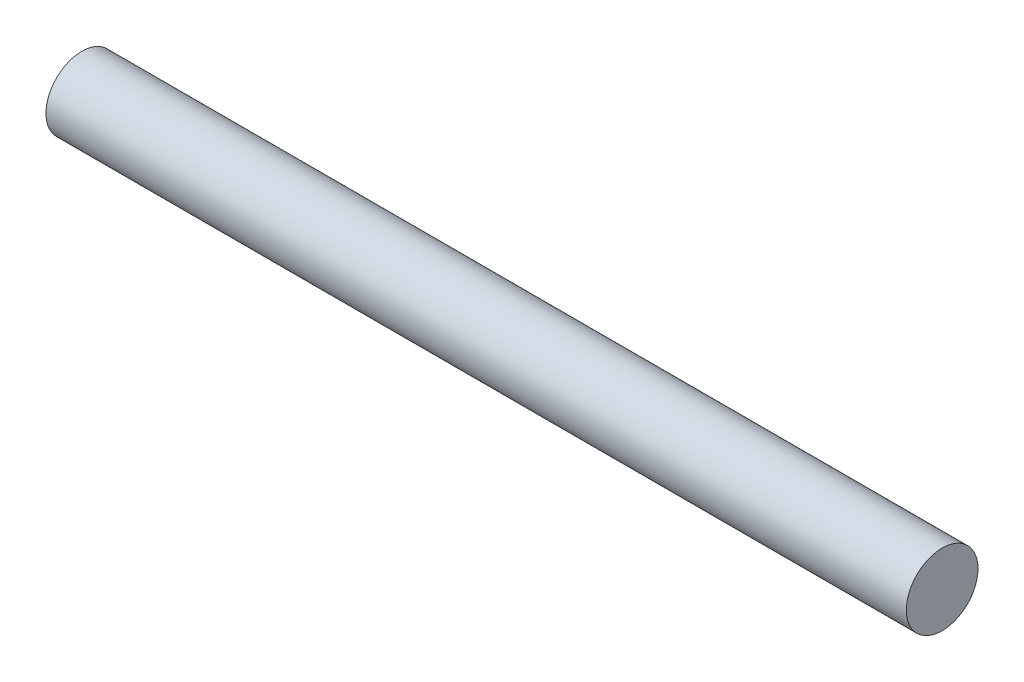
ISO-10303-21;
HEADER;
FILE_DESCRIPTION(('STEP AP214'),'2;1');
FILE_NAME('part.step','',(''),(''),'','','');
FILE_SCHEMA(('AUTOMOTIVE_DESIGN { 1 0 10303 214 1 1 1 1 }'));
ENDSEC;
DATA;
#1=APPLICATION_CONTEXT('core data for automotive mechanical design processes');
#2=APPLICATION_PROTOCOL_DEFINITION('international standard','automotive_design',2000,#1);
#3=PRODUCT_CONTEXT('',#1,'mechanical');
#4=PRODUCT('Part','Part','',(#3));
#5=PRODUCT_RELATED_PRODUCT_CATEGORY('part','',(#4));
#6=PRODUCT_DEFINITION_FORMATION('','',#4);
#7=PRODUCT_DEFINITION_CONTEXT('part definition',#1,'design');
#8=PRODUCT_DEFINITION('design','',#6,#7);
#9=PRODUCT_DEFINITION_SHAPE('','',#8);
#10=(LENGTH_UNIT() NAMED_UNIT(*) SI_UNIT(.MILLI.,.METRE.));
#11=(NAMED_UNIT(*) PLANE_ANGLE_UNIT() SI_UNIT($,.RADIAN.));
#12=(NAMED_UNIT(*) SI_UNIT($,.STERADIAN.) SOLID_ANGLE_UNIT());
#13=UNCERTAINTY_MEASURE_WITH_UNIT(LENGTH_MEASURE(1.E-05),#10,'distance_accuracy_value','');
#14=(GEOMETRIC_REPRESENTATION_CONTEXT(3) GLOBAL_UNCERTAINTY_ASSIGNED_CONTEXT((#13)) GLOBAL_UNIT_ASSIGNED_CONTEXT((#10,
#11,#12)) REPRESENTATION_CONTEXT('',''));
#15=CARTESIAN_POINT('',(0.,0.,0.));
#16=DIRECTION('',(0.,0.,1.));
#17=DIRECTION('',(1.,0.,0.));
#18=AXIS2_PLACEMENT_3D('',#15,#16,#17);
#19=CARTESIAN_POINT('',(-30.,0.,0.));
#20=DIRECTION('',(1.,0.,0.));
#21=DIRECTION('',(0.,0.,-1.));
#22=AXIS2_PLACEMENT_3D('',#19,#20,#21);
#23=CYLINDRICAL_SURFACE('',#22,2.5);
#24=CARTESIAN_POINT('',(-30.,0.,0.));
#25=DIRECTION('',(1.,0.,0.));
#26=DIRECTION('',(0.,0.,-1.));
#27=AXIS2_PLACEMENT_3D('',#24,#25,#26);
#28=CIRCLE('',#27,2.5);
#29=CARTESIAN_POINT('',(-30.,0.,-2.5));
#30=VERTEX_POINT('',#29);
#31=EDGE_CURVE('E10',#30,#30,#28,.T.);
#32=ORIENTED_EDGE('',*,*,#31,.T.);
#33=EDGE_LOOP('',(#32));
#34=FACE_BOUND('',#33,.T.);
#35=CARTESIAN_POINT('',(30.,0.,0.));
#36=DIRECTION('',(1.,0.,0.));
#37=DIRECTION('',(0.,0.,-1.));
#38=AXIS2_PLACEMENT_3D('',#35,#36,#37);
#39=CIRCLE('',#38,2.5);
#40=CARTESIAN_POINT('',(30.,0.,-2.5));
#41=VERTEX_POINT('',#40);
#42=EDGE_CURVE('E38',#41,#41,#39,.T.);
#43=ORIENTED_EDGE('',*,*,#42,.F.);
#44=EDGE_LOOP('',(#43));
#45=FACE_BOUND('',#44,.T.);
#46=ADVANCED_FACE('F32',(#34,#45),#23,.T.);
#47=CARTESIAN_POINT('',(-30.,0.,0.));
#48=DIRECTION('',(1.,0.,0.));
#49=DIRECTION('',(0.,0.,-1.));
#50=AXIS2_PLACEMENT_3D('',#47,#48,#49);
#51=PLANE('',#50);
#52=ORIENTED_EDGE('',*,*,#31,.F.);
#53=EDGE_LOOP('',(#52));
#54=FACE_BOUND('',#53,.T.);
#55=ADVANCED_FACE('F47',(#54),#51,.F.);
#56=CARTESIAN_POINT('',(30.,0.,0.));
#57=DIRECTION('',(1.,0.,0.));
#58=DIRECTION('',(0.,0.,-1.));
#59=AXIS2_PLACEMENT_3D('',#56,#57,#58);
#60=PLANE('',#59);
#61=ORIENTED_EDGE('',*,*,#42,.T.);
#62=EDGE_LOOP('',(#61));
#63=FACE_BOUND('',#62,.T.);
#64=ADVANCED_FACE('F44',(#63),#60,.T.);
#65=CLOSED_SHELL('',(#46,#55,#64));
#66=MANIFOLD_SOLID_BREP('B2',#65);
#67=ADVANCED_BREP_SHAPE_REPRESENTATION('',(#18,#66),#14);
#68=SHAPE_DEFINITION_REPRESENTATION(#9,#67);
ENDSEC;
END-ISO-10303-21;
